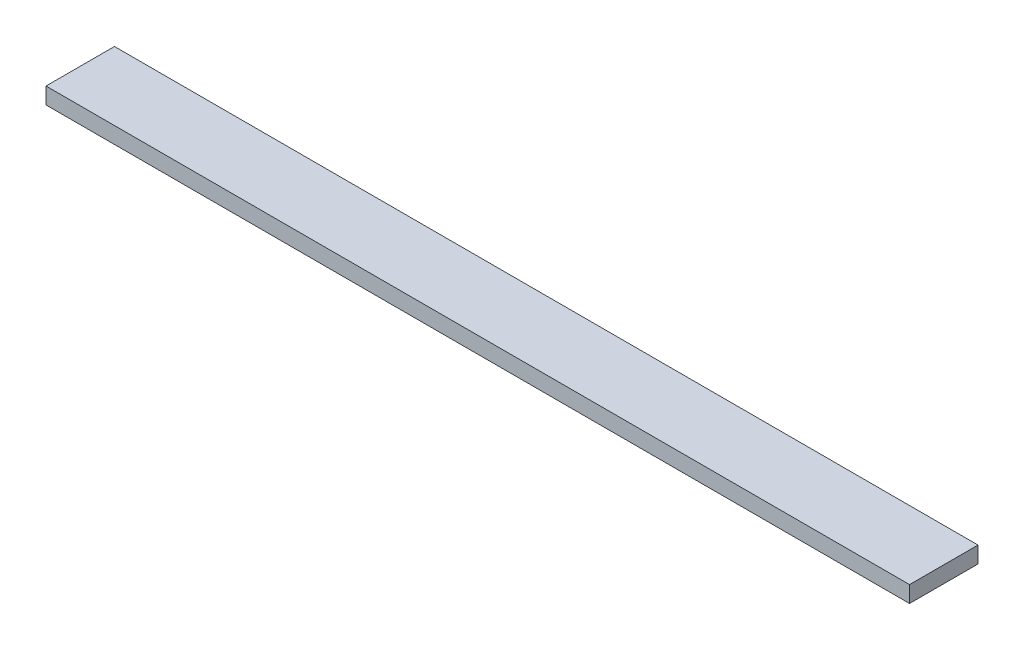
ISO-10303-21;
HEADER;
FILE_DESCRIPTION(('STEP AP214'),'2;1');
FILE_NAME('part.step','',(''),(''),'','','');
FILE_SCHEMA(('AUTOMOTIVE_DESIGN { 1 0 10303 214 1 1 1 1 }'));
ENDSEC;
DATA;
#1=APPLICATION_CONTEXT('core data for automotive mechanical design processes');
#2=APPLICATION_PROTOCOL_DEFINITION('international standard','automotive_design',2000,#1);
#3=PRODUCT_CONTEXT('',#1,'mechanical');
#4=PRODUCT('Part','Part','',(#3));
#5=PRODUCT_RELATED_PRODUCT_CATEGORY('part','',(#4));
#6=PRODUCT_DEFINITION_FORMATION('','',#4);
#7=PRODUCT_DEFINITION_CONTEXT('part definition',#1,'design');
#8=PRODUCT_DEFINITION('design','',#6,#7);
#9=PRODUCT_DEFINITION_SHAPE('','',#8);
#10=(LENGTH_UNIT() NAMED_UNIT(*) SI_UNIT(.MILLI.,.METRE.));
#11=(NAMED_UNIT(*) PLANE_ANGLE_UNIT() SI_UNIT($,.RADIAN.));
#12=(NAMED_UNIT(*) SI_UNIT($,.STERADIAN.) SOLID_ANGLE_UNIT());
#13=UNCERTAINTY_MEASURE_WITH_UNIT(LENGTH_MEASURE(1.E-05),#10,'distance_accuracy_value','');
#14=(GEOMETRIC_REPRESENTATION_CONTEXT(3) GLOBAL_UNCERTAINTY_ASSIGNED_CONTEXT((#13)) GLOBAL_UNIT_ASSIGNED_CONTEXT((#10,
#11,#12)) REPRESENTATION_CONTEXT('',''));
#15=CARTESIAN_POINT('',(0.,0.,0.));
#16=DIRECTION('',(0.,0.,1.));
#17=DIRECTION('',(1.,0.,0.));
#18=AXIS2_PLACEMENT_3D('',#15,#16,#17);
#19=CARTESIAN_POINT('',(480.568,18.25625,38.1));
#20=DIRECTION('',(-1.,0.,0.));
#21=DIRECTION('',(0.,0.,1.));
#22=AXIS2_PLACEMENT_3D('',#19,#20,#21);
#23=PLANE('',#22);
#24=DIRECTION('',(0.,0.,-1.));
#25=VECTOR('',#24,1.);
#26=CARTESIAN_POINT('',(480.568,0.,38.1));
#27=LINE('',#26,#25);
#28=CARTESIAN_POINT('',(480.568,0.,38.1));
#29=VERTEX_POINT('',#28);
#30=CARTESIAN_POINT('',(480.568,0.,-38.1));
#31=VERTEX_POINT('',#30);
#32=EDGE_CURVE('E97',#29,#31,#27,.T.);
#33=ORIENTED_EDGE('',*,*,#32,.T.);
#34=DIRECTION('',(0.,-1.,0.));
#35=VECTOR('',#34,1.);
#36=CARTESIAN_POINT('',(480.568,18.25625,-38.1));
#37=LINE('',#36,#35);
#38=CARTESIAN_POINT('',(480.568,18.25625,-38.1));
#39=VERTEX_POINT('',#38);
#40=EDGE_CURVE('E11',#39,#31,#37,.T.);
#41=ORIENTED_EDGE('',*,*,#40,.F.);
#42=DIRECTION('',(0.,0.,-1.));
#43=VECTOR('',#42,1.);
#44=CARTESIAN_POINT('',(480.568,18.25625,38.1));
#45=LINE('',#44,#43);
#46=CARTESIAN_POINT('',(480.568,18.25625,38.1));
#47=VERTEX_POINT('',#46);
#48=EDGE_CURVE('E85',#47,#39,#45,.T.);
#49=ORIENTED_EDGE('',*,*,#48,.F.);
#50=DIRECTION('',(0.,-1.,0.));
#51=VECTOR('',#50,1.);
#52=CARTESIAN_POINT('',(480.568,18.25625,38.1));
#53=LINE('',#52,#51);
#54=EDGE_CURVE('E93',#47,#29,#53,.T.);
#55=ORIENTED_EDGE('',*,*,#54,.T.);
#56=EDGE_LOOP('',(#33,#41,#49,#55));
#57=FACE_BOUND('',#56,.T.);
#58=ADVANCED_FACE('F34',(#57),#23,.F.);
#59=CARTESIAN_POINT('',(-480.568,18.25625,-38.1));
#60=DIRECTION('',(0.,0.,1.));
#61=DIRECTION('',(1.,0.,0.));
#62=AXIS2_PLACEMENT_3D('',#59,#60,#61);
#63=PLANE('',#62);
#64=DIRECTION('',(-1.,0.,0.));
#65=VECTOR('',#64,1.);
#66=CARTESIAN_POINT('',(-480.568,0.,-38.1));
#67=LINE('',#66,#65);
#68=CARTESIAN_POINT('',(-480.568,0.,-38.1));
#69=VERTEX_POINT('',#68);
#70=EDGE_CURVE('E89',#31,#69,#67,.T.);
#71=ORIENTED_EDGE('',*,*,#70,.T.);
#72=DIRECTION('',(0.,-1.,0.));
#73=VECTOR('',#72,1.);
#74=CARTESIAN_POINT('',(-480.568,18.25625,-38.1));
#75=LINE('',#74,#73);
#76=CARTESIAN_POINT('',(-480.568,18.25625,-38.1));
#77=VERTEX_POINT('',#76);
#78=EDGE_CURVE('E42',#77,#69,#75,.T.);
#79=ORIENTED_EDGE('',*,*,#78,.F.);
#80=DIRECTION('',(-1.,0.,0.));
#81=VECTOR('',#80,1.);
#82=CARTESIAN_POINT('',(-480.568,18.25625,-38.1));
#83=LINE('',#82,#81);
#84=EDGE_CURVE('E80',#39,#77,#83,.T.);
#85=ORIENTED_EDGE('',*,*,#84,.F.);
#86=ORIENTED_EDGE('',*,*,#40,.T.);
#87=EDGE_LOOP('',(#71,#79,#85,#86));
#88=FACE_BOUND('',#87,.T.);
#89=ADVANCED_FACE('F88',(#88),#63,.F.);
#90=CARTESIAN_POINT('',(-480.568,18.25625,38.1));
#91=DIRECTION('',(1.,0.,0.));
#92=DIRECTION('',(0.,0.,-1.));
#93=AXIS2_PLACEMENT_3D('',#90,#91,#92);
#94=PLANE('',#93);
#95=DIRECTION('',(0.,0.,1.));
#96=VECTOR('',#95,1.);
#97=CARTESIAN_POINT('',(-480.568,0.,38.1));
#98=LINE('',#97,#96);
#99=CARTESIAN_POINT('',(-480.568,0.,38.1));
#100=VERTEX_POINT('',#99);
#101=EDGE_CURVE('E67',#69,#100,#98,.T.);
#102=ORIENTED_EDGE('',*,*,#101,.T.);
#103=DIRECTION('',(0.,-1.,0.));
#104=VECTOR('',#103,1.);
#105=CARTESIAN_POINT('',(-480.568,18.25625,38.1));
#106=LINE('',#105,#104);
#107=CARTESIAN_POINT('',(-480.568,18.25625,38.1));
#108=VERTEX_POINT('',#107);
#109=EDGE_CURVE('E90',#108,#100,#106,.T.);
#110=ORIENTED_EDGE('',*,*,#109,.F.);
#111=DIRECTION('',(0.,0.,1.));
#112=VECTOR('',#111,1.);
#113=CARTESIAN_POINT('',(-480.568,18.25625,38.1));
#114=LINE('',#113,#112);
#115=EDGE_CURVE('E83',#77,#108,#114,.T.);
#116=ORIENTED_EDGE('',*,*,#115,.F.);
#117=ORIENTED_EDGE('',*,*,#78,.T.);
#118=EDGE_LOOP('',(#102,#110,#116,#117));
#119=FACE_BOUND('',#118,.T.);
#120=ADVANCED_FACE('F91',(#119),#94,.F.);
#121=CARTESIAN_POINT('',(-480.568,18.25625,38.1));
#122=DIRECTION('',(0.,0.,-1.));
#123=DIRECTION('',(-1.,0.,0.));
#124=AXIS2_PLACEMENT_3D('',#121,#122,#123);
#125=PLANE('',#124);
#126=DIRECTION('',(1.,0.,0.));
#127=VECTOR('',#126,1.);
#128=CARTESIAN_POINT('',(-480.568,0.,38.1));
#129=LINE('',#128,#127);
#130=EDGE_CURVE('E73',#100,#29,#129,.T.);
#131=ORIENTED_EDGE('',*,*,#130,.T.);
#132=ORIENTED_EDGE('',*,*,#54,.F.);
#133=DIRECTION('',(1.,0.,0.));
#134=VECTOR('',#133,1.);
#135=CARTESIAN_POINT('',(-480.568,18.25625,38.1));
#136=LINE('',#135,#134);
#137=EDGE_CURVE('E50',#108,#47,#136,.T.);
#138=ORIENTED_EDGE('',*,*,#137,.F.);
#139=ORIENTED_EDGE('',*,*,#109,.T.);
#140=EDGE_LOOP('',(#131,#132,#138,#139));
#141=FACE_BOUND('',#140,.T.);
#142=ADVANCED_FACE('F104',(#141),#125,.F.);
#143=CARTESIAN_POINT('',(0.,18.25625,0.));
#144=DIRECTION('',(0.,-1.,0.));
#145=DIRECTION('',(0.,0.,-1.));
#146=AXIS2_PLACEMENT_3D('',#143,#144,#145);
#147=PLANE('',#146);
#148=ORIENTED_EDGE('',*,*,#48,.T.);
#149=ORIENTED_EDGE('',*,*,#84,.T.);
#150=ORIENTED_EDGE('',*,*,#115,.T.);
#151=ORIENTED_EDGE('',*,*,#137,.T.);
#152=EDGE_LOOP('',(#148,#149,#150,#151));
#153=FACE_BOUND('',#152,.T.);
#154=ADVANCED_FACE('F81',(#153),#147,.F.);
#155=CARTESIAN_POINT('',(0.,0.,0.));
#156=DIRECTION('',(0.,-1.,0.));
#157=DIRECTION('',(0.,0.,-1.));
#158=AXIS2_PLACEMENT_3D('',#155,#156,#157);
#159=PLANE('',#158);
#160=ORIENTED_EDGE('',*,*,#32,.F.);
#161=ORIENTED_EDGE('',*,*,#130,.F.);
#162=ORIENTED_EDGE('',*,*,#101,.F.);
#163=ORIENTED_EDGE('',*,*,#70,.F.);
#164=EDGE_LOOP('',(#160,#161,#162,#163));
#165=FACE_BOUND('',#164,.T.);
#166=ADVANCED_FACE('F107',(#165),#159,.T.);
#167=CLOSED_SHELL('',(#58,#89,#120,#142,#154,#166));
#168=MANIFOLD_SOLID_BREP('B2',#167);
#169=ADVANCED_BREP_SHAPE_REPRESENTATION('',(#18,#168),#14);
#170=SHAPE_DEFINITION_REPRESENTATION(#9,#169);
ENDSEC;
END-ISO-10303-21;
